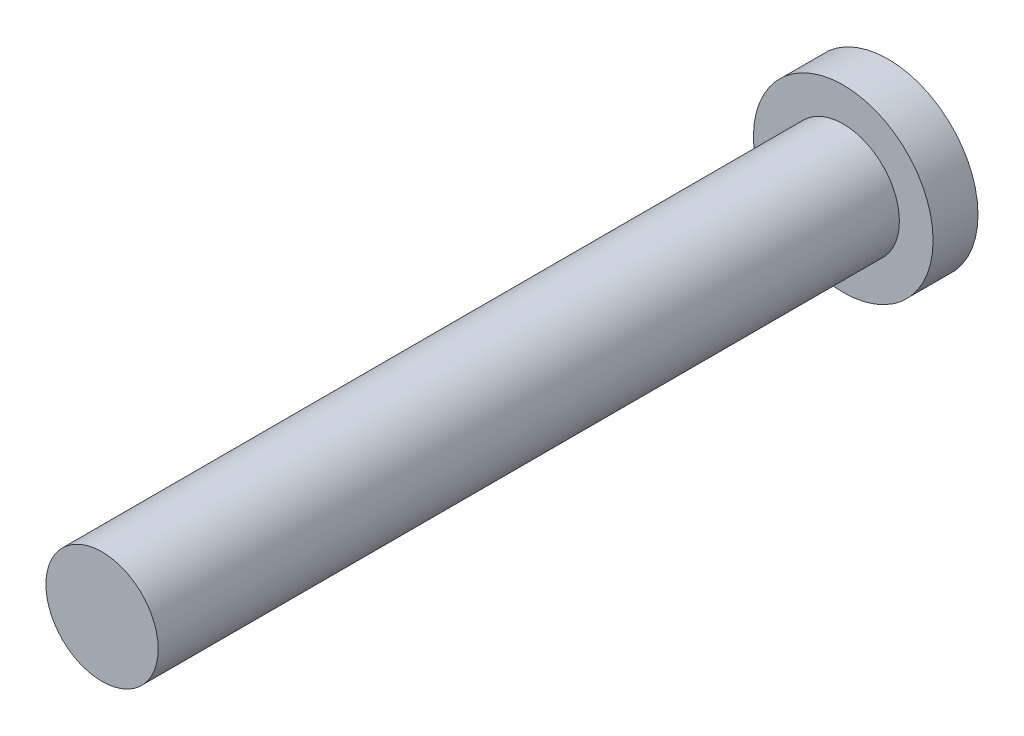
ISO-10303-21;
HEADER;
FILE_DESCRIPTION(('STEP AP214'),'2;1');
FILE_NAME('part.step','',(''),(''),'','','');
FILE_SCHEMA(('AUTOMOTIVE_DESIGN { 1 0 10303 214 1 1 1 1 }'));
ENDSEC;
DATA;
#1=APPLICATION_CONTEXT('core data for automotive mechanical design processes');
#2=APPLICATION_PROTOCOL_DEFINITION('international standard','automotive_design',2000,#1);
#3=PRODUCT_CONTEXT('',#1,'mechanical');
#4=PRODUCT('Part','Part','',(#3));
#5=PRODUCT_RELATED_PRODUCT_CATEGORY('part','',(#4));
#6=PRODUCT_DEFINITION_FORMATION('','',#4);
#7=PRODUCT_DEFINITION_CONTEXT('part definition',#1,'design');
#8=PRODUCT_DEFINITION('design','',#6,#7);
#9=PRODUCT_DEFINITION_SHAPE('','',#8);
#10=(LENGTH_UNIT() NAMED_UNIT(*) SI_UNIT(.MILLI.,.METRE.));
#11=(NAMED_UNIT(*) PLANE_ANGLE_UNIT() SI_UNIT($,.RADIAN.));
#12=(NAMED_UNIT(*) SI_UNIT($,.STERADIAN.) SOLID_ANGLE_UNIT());
#13=UNCERTAINTY_MEASURE_WITH_UNIT(LENGTH_MEASURE(1.E-05),#10,'distance_accuracy_value','');
#14=(GEOMETRIC_REPRESENTATION_CONTEXT(3) GLOBAL_UNCERTAINTY_ASSIGNED_CONTEXT((#13)) GLOBAL_UNIT_ASSIGNED_CONTEXT((#10,
#11,#12)) REPRESENTATION_CONTEXT('',''));
#15=CARTESIAN_POINT('',(0.,0.,0.));
#16=DIRECTION('',(0.,0.,1.));
#17=DIRECTION('',(1.,0.,0.));
#18=AXIS2_PLACEMENT_3D('',#15,#16,#17);
#19=CARTESIAN_POINT('',(0.,0.,2.));
#20=DIRECTION('',(0.,0.,1.));
#21=DIRECTION('',(1.,0.,0.));
#22=AXIS2_PLACEMENT_3D('',#19,#20,#21);
#23=PLANE('',#22);
#24=CARTESIAN_POINT('',(0.,0.,2.));
#25=DIRECTION('',(0.,0.,1.));
#26=DIRECTION('',(1.,0.,0.));
#27=AXIS2_PLACEMENT_3D('',#24,#25,#26);
#28=CIRCLE('',#27,4.);
#29=CARTESIAN_POINT('',(4.,0.,2.));
#30=VERTEX_POINT('',#29);
#31=EDGE_CURVE('E10',#30,#30,#28,.T.);
#32=ORIENTED_EDGE('',*,*,#31,.T.);
#33=EDGE_LOOP('',(#32));
#34=FACE_BOUND('',#33,.T.);
#35=CARTESIAN_POINT('',(0.,0.,2.));
#36=DIRECTION('',(0.,0.,1.));
#37=DIRECTION('',(1.,0.,0.));
#38=AXIS2_PLACEMENT_3D('',#35,#36,#37);
#39=CIRCLE('',#38,2.5);
#40=CARTESIAN_POINT('',(2.5,0.,2.));
#41=VERTEX_POINT('',#40);
#42=EDGE_CURVE('E48',#41,#41,#39,.T.);
#43=ORIENTED_EDGE('',*,*,#42,.F.);
#44=EDGE_LOOP('',(#43));
#45=FACE_BOUND('',#44,.T.);
#46=ADVANCED_FACE('F37',(#34,#45),#23,.T.);
#47=CARTESIAN_POINT('',(0.,0.,0.));
#48=DIRECTION('',(0.,0.,1.));
#49=DIRECTION('',(1.,0.,0.));
#50=AXIS2_PLACEMENT_3D('',#47,#48,#49);
#51=PLANE('',#50);
#52=CARTESIAN_POINT('',(0.,0.,0.));
#53=DIRECTION('',(0.,0.,1.));
#54=DIRECTION('',(1.,0.,0.));
#55=AXIS2_PLACEMENT_3D('',#52,#53,#54);
#56=CIRCLE('',#55,4.);
#57=CARTESIAN_POINT('',(4.,0.,0.));
#58=VERTEX_POINT('',#57);
#59=EDGE_CURVE('E41',#58,#58,#56,.T.);
#60=ORIENTED_EDGE('',*,*,#59,.F.);
#61=EDGE_LOOP('',(#60));
#62=FACE_BOUND('',#61,.T.);
#63=ADVANCED_FACE('F67',(#62),#51,.F.);
#64=CARTESIAN_POINT('',(0.,0.,2.));
#65=DIRECTION('',(0.,0.,-1.));
#66=DIRECTION('',(-1.,0.,0.));
#67=AXIS2_PLACEMENT_3D('',#64,#65,#66);
#68=CYLINDRICAL_SURFACE('',#67,4.);
#69=ORIENTED_EDGE('',*,*,#31,.F.);
#70=EDGE_LOOP('',(#69));
#71=FACE_BOUND('',#70,.T.);
#72=ORIENTED_EDGE('',*,*,#59,.T.);
#73=EDGE_LOOP('',(#72));
#74=FACE_BOUND('',#73,.T.);
#75=ADVANCED_FACE('F39',(#71,#74),#68,.T.);
#76=CARTESIAN_POINT('',(0.,0.,35.));
#77=DIRECTION('',(0.,0.,-1.));
#78=DIRECTION('',(-1.,0.,0.));
#79=AXIS2_PLACEMENT_3D('',#76,#77,#78);
#80=CYLINDRICAL_SURFACE('',#79,2.5);
#81=ORIENTED_EDGE('',*,*,#42,.T.);
#82=EDGE_LOOP('',(#81));
#83=FACE_BOUND('',#82,.T.);
#84=CARTESIAN_POINT('',(0.,0.,35.));
#85=DIRECTION('',(0.,0.,1.));
#86=DIRECTION('',(1.,0.,0.));
#87=AXIS2_PLACEMENT_3D('',#84,#85,#86);
#88=CIRCLE('',#87,2.5);
#89=CARTESIAN_POINT('',(2.5,0.,35.));
#90=VERTEX_POINT('',#89);
#91=EDGE_CURVE('E52',#90,#90,#88,.T.);
#92=ORIENTED_EDGE('',*,*,#91,.F.);
#93=EDGE_LOOP('',(#92));
#94=FACE_BOUND('',#93,.T.);
#95=ADVANCED_FACE('F58',(#83,#94),#80,.T.);
#96=CARTESIAN_POINT('',(0.,0.,35.));
#97=DIRECTION('',(0.,0.,1.));
#98=DIRECTION('',(1.,0.,0.));
#99=AXIS2_PLACEMENT_3D('',#96,#97,#98);
#100=PLANE('',#99);
#101=ORIENTED_EDGE('',*,*,#91,.T.);
#102=EDGE_LOOP('',(#101));
#103=FACE_BOUND('',#102,.T.);
#104=ADVANCED_FACE('F56',(#103),#100,.T.);
#105=CLOSED_SHELL('',(#46,#63,#75,#95,#104));
#106=MANIFOLD_SOLID_BREP('B2',#105);
#107=ADVANCED_BREP_SHAPE_REPRESENTATION('',(#18,#106),#14);
#108=SHAPE_DEFINITION_REPRESENTATION(#9,#107);
ENDSEC;
END-ISO-10303-21;
